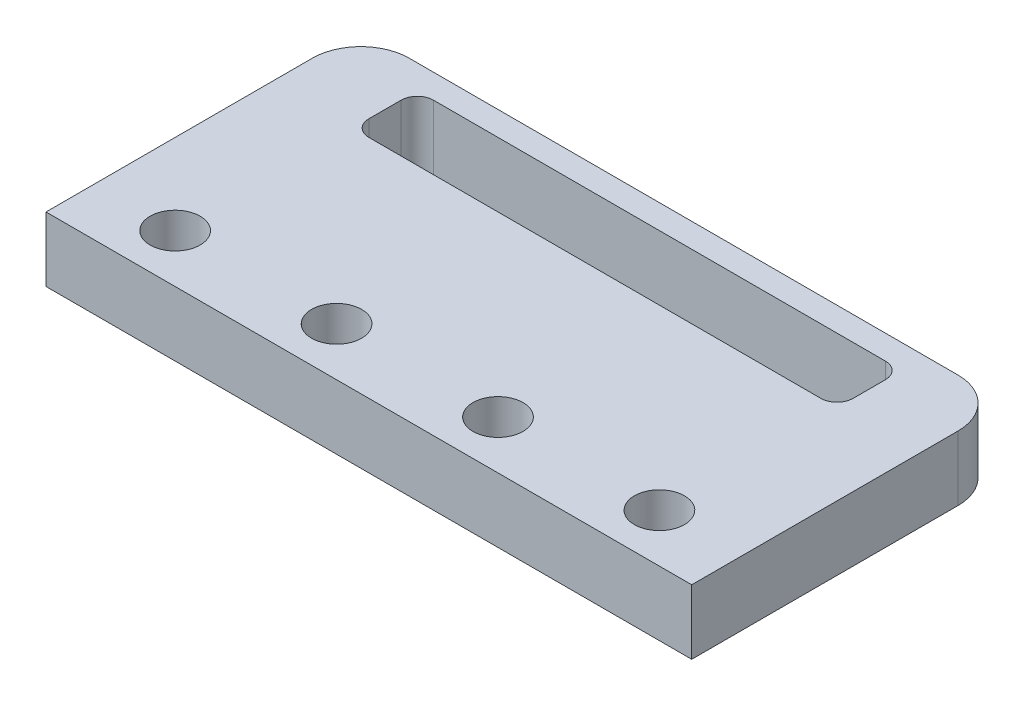
ISO-10303-21;
HEADER;
FILE_DESCRIPTION(('STEP AP214'),'2;1');
FILE_NAME('part.step','',(''),(''),'','','');
FILE_SCHEMA(('AUTOMOTIVE_DESIGN { 1 0 10303 214 1 1 1 1 }'));
ENDSEC;
DATA;
#1=APPLICATION_CONTEXT('core data for automotive mechanical design processes');
#2=APPLICATION_PROTOCOL_DEFINITION('international standard','automotive_design',2000,#1);
#3=PRODUCT_CONTEXT('',#1,'mechanical');
#4=PRODUCT('Part','Part','',(#3));
#5=PRODUCT_RELATED_PRODUCT_CATEGORY('part','',(#4));
#6=PRODUCT_DEFINITION_FORMATION('','',#4);
#7=PRODUCT_DEFINITION_CONTEXT('part definition',#1,'design');
#8=PRODUCT_DEFINITION('design','',#6,#7);
#9=PRODUCT_DEFINITION_SHAPE('','',#8);
#10=(LENGTH_UNIT() NAMED_UNIT(*) SI_UNIT(.MILLI.,.METRE.));
#11=(NAMED_UNIT(*) PLANE_ANGLE_UNIT() SI_UNIT($,.RADIAN.));
#12=(NAMED_UNIT(*) SI_UNIT($,.STERADIAN.) SOLID_ANGLE_UNIT());
#13=UNCERTAINTY_MEASURE_WITH_UNIT(LENGTH_MEASURE(1.E-05),#10,'distance_accuracy_value','');
#14=(GEOMETRIC_REPRESENTATION_CONTEXT(3) GLOBAL_UNCERTAINTY_ASSIGNED_CONTEXT((#13)) GLOBAL_UNIT_ASSIGNED_CONTEXT((#10,
#11,#12)) REPRESENTATION_CONTEXT('',''));
#15=CARTESIAN_POINT('',(0.,0.,0.));
#16=DIRECTION('',(0.,0.,1.));
#17=DIRECTION('',(1.,0.,0.));
#18=AXIS2_PLACEMENT_3D('',#15,#16,#17);
#19=CARTESIAN_POINT('',(0.,4.,0.));
#20=DIRECTION('',(0.,-1.,0.));
#21=DIRECTION('',(0.,0.,-1.));
#22=AXIS2_PLACEMENT_3D('',#19,#20,#21);
#23=PLANE('',#22);
#24=DIRECTION('',(0.,0.,-1.));
#25=VECTOR('',#24,1.);
#26=CARTESIAN_POINT('',(15.,4.,-5.25000000000001));
#27=LINE('',#26,#25);
#28=CARTESIAN_POINT('',(15.,4.,-5.25000000000001));
#29=VERTEX_POINT('',#28);
#30=CARTESIAN_POINT('',(15.,4.,-7.25));
#31=VERTEX_POINT('',#30);
#32=EDGE_CURVE('E191',#29,#31,#27,.T.);
#33=ORIENTED_EDGE('',*,*,#32,.F.);
#34=CARTESIAN_POINT('',(14.,4.,-5.25));
#35=DIRECTION('',(0.,1.,0.));
#36=DIRECTION('',(0.,0.,1.));
#37=AXIS2_PLACEMENT_3D('',#34,#35,#36);
#38=CIRCLE('',#37,1.);
#39=CARTESIAN_POINT('',(14.,4.,-4.25));
#40=VERTEX_POINT('',#39);
#41=EDGE_CURVE('E152',#40,#29,#38,.T.);
#42=ORIENTED_EDGE('',*,*,#41,.F.);
#43=DIRECTION('',(1.,0.,0.));
#44=VECTOR('',#43,1.);
#45=CARTESIAN_POINT('',(-14.,4.,-4.25));
#46=LINE('',#45,#44);
#47=CARTESIAN_POINT('',(-14.,4.,-4.25));
#48=VERTEX_POINT('',#47);
#49=EDGE_CURVE('E171',#48,#40,#46,.T.);
#50=ORIENTED_EDGE('',*,*,#49,.F.);
#51=CARTESIAN_POINT('',(-14.,4.,-5.25));
#52=DIRECTION('',(0.,1.,0.));
#53=DIRECTION('',(0.,0.,-1.));
#54=AXIS2_PLACEMENT_3D('',#51,#52,#53);
#55=CIRCLE('',#54,1.);
#56=CARTESIAN_POINT('',(-15.,4.,-5.25000000000001));
#57=VERTEX_POINT('',#56);
#58=EDGE_CURVE('E174',#57,#48,#55,.T.);
#59=ORIENTED_EDGE('',*,*,#58,.F.);
#60=DIRECTION('',(0.,0.,1.));
#61=VECTOR('',#60,1.);
#62=CARTESIAN_POINT('',(-15.,4.,-5.25000000000001));
#63=LINE('',#62,#61);
#64=CARTESIAN_POINT('',(-15.,4.,-7.25));
#65=VERTEX_POINT('',#64);
#66=EDGE_CURVE('E202',#65,#57,#63,.T.);
#67=ORIENTED_EDGE('',*,*,#66,.F.);
#68=CARTESIAN_POINT('',(-14.,4.,-7.25));
#69=DIRECTION('',(0.,1.,0.));
#70=DIRECTION('',(0.,0.,-1.));
#71=AXIS2_PLACEMENT_3D('',#68,#69,#70);
#72=CIRCLE('',#71,1.);
#73=CARTESIAN_POINT('',(-14.,4.,-8.25));
#74=VERTEX_POINT('',#73);
#75=EDGE_CURVE('E199',#74,#65,#72,.T.);
#76=ORIENTED_EDGE('',*,*,#75,.F.);
#77=DIRECTION('',(-1.,0.,0.));
#78=VECTOR('',#77,1.);
#79=CARTESIAN_POINT('',(-14.,4.,-8.25));
#80=LINE('',#79,#78);
#81=CARTESIAN_POINT('',(14.,4.,-8.25));
#82=VERTEX_POINT('',#81);
#83=EDGE_CURVE('E196',#82,#74,#80,.T.);
#84=ORIENTED_EDGE('',*,*,#83,.F.);
#85=CARTESIAN_POINT('',(14.,4.,-7.25));
#86=DIRECTION('',(0.,1.,0.));
#87=DIRECTION('',(0.,0.,-1.));
#88=AXIS2_PLACEMENT_3D('',#85,#86,#87);
#89=CIRCLE('',#88,1.);
#90=EDGE_CURVE('E193',#31,#82,#89,.T.);
#91=ORIENTED_EDGE('',*,*,#90,.F.);
#92=EDGE_LOOP('',(#33,#42,#50,#59,#67,#76,#84,#91));
#93=FACE_BOUND('',#92,.T.);
#94=DIRECTION('',(0.,0.,-1.));
#95=VECTOR('',#94,1.);
#96=CARTESIAN_POINT('',(20.,4.,9.75));
#97=LINE('',#96,#95);
#98=CARTESIAN_POINT('',(20.,4.,9.75));
#99=VERTEX_POINT('',#98);
#100=CARTESIAN_POINT('',(20.,4.,-6.75));
#101=VERTEX_POINT('',#100);
#102=EDGE_CURVE('E245',#99,#101,#97,.T.);
#103=ORIENTED_EDGE('',*,*,#102,.T.);
#104=CARTESIAN_POINT('',(17.,4.,-6.75));
#105=DIRECTION('',(0.,-1.,0.));
#106=DIRECTION('',(0.,0.,-1.));
#107=AXIS2_PLACEMENT_3D('',#104,#105,#106);
#108=CIRCLE('',#107,3.);
#109=CARTESIAN_POINT('',(17.,4.,-9.75));
#110=VERTEX_POINT('',#109);
#111=EDGE_CURVE('E49',#101,#110,#108,.F.);
#112=ORIENTED_EDGE('',*,*,#111,.T.);
#113=DIRECTION('',(-1.,0.,0.));
#114=VECTOR('',#113,1.);
#115=CARTESIAN_POINT('',(-20.,4.,-9.75));
#116=LINE('',#115,#114);
#117=CARTESIAN_POINT('',(-17.,4.,-9.75));
#118=VERTEX_POINT('',#117);
#119=EDGE_CURVE('E247',#110,#118,#116,.T.);
#120=ORIENTED_EDGE('',*,*,#119,.T.);
#121=CARTESIAN_POINT('',(-17.,4.,-6.75));
#122=DIRECTION('',(0.,-1.,0.));
#123=DIRECTION('',(0.,0.,-1.));
#124=AXIS2_PLACEMENT_3D('',#121,#122,#123);
#125=CIRCLE('',#124,3.);
#126=CARTESIAN_POINT('',(-20.,4.,-6.75));
#127=VERTEX_POINT('',#126);
#128=EDGE_CURVE('E56',#118,#127,#125,.F.);
#129=ORIENTED_EDGE('',*,*,#128,.T.);
#130=DIRECTION('',(0.,0.,1.));
#131=VECTOR('',#130,1.);
#132=CARTESIAN_POINT('',(-20.,4.,9.75));
#133=LINE('',#132,#131);
#134=CARTESIAN_POINT('',(-20.,4.,9.75));
#135=VERTEX_POINT('',#134);
#136=EDGE_CURVE('E250',#127,#135,#133,.T.);
#137=ORIENTED_EDGE('',*,*,#136,.T.);
#138=DIRECTION('',(1.,0.,0.));
#139=VECTOR('',#138,1.);
#140=CARTESIAN_POINT('',(-20.,4.,9.75));
#141=LINE('',#140,#139);
#142=EDGE_CURVE('E252',#135,#99,#141,.T.);
#143=ORIENTED_EDGE('',*,*,#142,.T.);
#144=EDGE_LOOP('',(#103,#112,#120,#129,#137,#143));
#145=FACE_BOUND('',#144,.T.);
#146=CARTESIAN_POINT('',(-15.,4.,6.75));
#147=DIRECTION('',(0.,1.,0.));
#148=DIRECTION('',(0.,0.,1.));
#149=AXIS2_PLACEMENT_3D('',#146,#147,#148);
#150=CIRCLE('',#149,1.55);
#151=CARTESIAN_POINT('',(-15.,4.,8.3));
#152=VERTEX_POINT('',#151);
#153=EDGE_CURVE('E239',#152,#152,#150,.T.);
#154=ORIENTED_EDGE('',*,*,#153,.F.);
#155=EDGE_LOOP('',(#154));
#156=FACE_BOUND('',#155,.T.);
#157=CARTESIAN_POINT('',(-5.,4.,6.75));
#158=DIRECTION('',(0.,1.,0.));
#159=DIRECTION('',(0.,0.,1.));
#160=AXIS2_PLACEMENT_3D('',#157,#158,#159);
#161=CIRCLE('',#160,1.55);
#162=CARTESIAN_POINT('',(-5.,4.,8.3));
#163=VERTEX_POINT('',#162);
#164=EDGE_CURVE('E233',#163,#163,#161,.T.);
#165=ORIENTED_EDGE('',*,*,#164,.F.);
#166=EDGE_LOOP('',(#165));
#167=FACE_BOUND('',#166,.T.);
#168=CARTESIAN_POINT('',(15.,4.,6.75));
#169=DIRECTION('',(0.,1.,0.));
#170=DIRECTION('',(0.,0.,-1.));
#171=AXIS2_PLACEMENT_3D('',#168,#169,#170);
#172=CIRCLE('',#171,1.55);
#173=CARTESIAN_POINT('',(15.,4.,5.2));
#174=VERTEX_POINT('',#173);
#175=EDGE_CURVE('E227',#174,#174,#172,.T.);
#176=ORIENTED_EDGE('',*,*,#175,.F.);
#177=EDGE_LOOP('',(#176));
#178=FACE_BOUND('',#177,.T.);
#179=CARTESIAN_POINT('',(5.,4.,6.75));
#180=DIRECTION('',(0.,1.,0.));
#181=DIRECTION('',(0.,0.,-1.));
#182=AXIS2_PLACEMENT_3D('',#179,#180,#181);
#183=CIRCLE('',#182,1.55);
#184=CARTESIAN_POINT('',(5.,4.,5.2));
#185=VERTEX_POINT('',#184);
#186=EDGE_CURVE('E221',#185,#185,#183,.T.);
#187=ORIENTED_EDGE('',*,*,#186,.F.);
#188=EDGE_LOOP('',(#187));
#189=FACE_BOUND('',#188,.T.);
#190=ADVANCED_FACE('F41',(#93,#145,#156,#167,#178,#189),#23,.F.);
#191=CARTESIAN_POINT('',(0.,0.,0.));
#192=DIRECTION('',(0.,-1.,0.));
#193=DIRECTION('',(0.,0.,-1.));
#194=AXIS2_PLACEMENT_3D('',#191,#192,#193);
#195=PLANE('',#194);
#196=CARTESIAN_POINT('',(14.,0.,-5.25));
#197=DIRECTION('',(0.,1.,0.));
#198=DIRECTION('',(0.,0.,1.));
#199=AXIS2_PLACEMENT_3D('',#196,#197,#198);
#200=CIRCLE('',#199,1.);
#201=CARTESIAN_POINT('',(14.,0.,-4.25));
#202=VERTEX_POINT('',#201);
#203=CARTESIAN_POINT('',(15.,0.,-5.25000000000001));
#204=VERTEX_POINT('',#203);
#205=EDGE_CURVE('E149',#202,#204,#200,.T.);
#206=ORIENTED_EDGE('',*,*,#205,.T.);
#207=DIRECTION('',(0.,0.,-1.));
#208=VECTOR('',#207,1.);
#209=CARTESIAN_POINT('',(15.,0.,-5.25000000000001));
#210=LINE('',#209,#208);
#211=CARTESIAN_POINT('',(15.,0.,-7.25));
#212=VERTEX_POINT('',#211);
#213=EDGE_CURVE('E161',#204,#212,#210,.T.);
#214=ORIENTED_EDGE('',*,*,#213,.T.);
#215=CARTESIAN_POINT('',(14.,0.,-7.25));
#216=DIRECTION('',(0.,1.,0.));
#217=DIRECTION('',(0.,0.,-1.));
#218=AXIS2_PLACEMENT_3D('',#215,#216,#217);
#219=CIRCLE('',#218,1.);
#220=CARTESIAN_POINT('',(14.,0.,-8.25));
#221=VERTEX_POINT('',#220);
#222=EDGE_CURVE('E165',#212,#221,#219,.T.);
#223=ORIENTED_EDGE('',*,*,#222,.T.);
#224=DIRECTION('',(-1.,0.,0.));
#225=VECTOR('',#224,1.);
#226=CARTESIAN_POINT('',(-14.,0.,-8.25));
#227=LINE('',#226,#225);
#228=CARTESIAN_POINT('',(-14.,0.,-8.25));
#229=VERTEX_POINT('',#228);
#230=EDGE_CURVE('E178',#221,#229,#227,.T.);
#231=ORIENTED_EDGE('',*,*,#230,.T.);
#232=CARTESIAN_POINT('',(-14.,0.,-7.25));
#233=DIRECTION('',(0.,1.,0.));
#234=DIRECTION('',(0.,0.,-1.));
#235=AXIS2_PLACEMENT_3D('',#232,#233,#234);
#236=CIRCLE('',#235,1.);
#237=CARTESIAN_POINT('',(-15.,0.,-7.25));
#238=VERTEX_POINT('',#237);
#239=EDGE_CURVE('E181',#229,#238,#236,.T.);
#240=ORIENTED_EDGE('',*,*,#239,.T.);
#241=DIRECTION('',(0.,0.,1.));
#242=VECTOR('',#241,1.);
#243=CARTESIAN_POINT('',(-15.,0.,-5.25000000000001));
#244=LINE('',#243,#242);
#245=CARTESIAN_POINT('',(-15.,0.,-5.25000000000001));
#246=VERTEX_POINT('',#245);
#247=EDGE_CURVE('E184',#238,#246,#244,.T.);
#248=ORIENTED_EDGE('',*,*,#247,.T.);
#249=CARTESIAN_POINT('',(-14.,0.,-5.25));
#250=DIRECTION('',(0.,1.,0.));
#251=DIRECTION('',(0.,0.,-1.));
#252=AXIS2_PLACEMENT_3D('',#249,#250,#251);
#253=CIRCLE('',#252,1.);
#254=CARTESIAN_POINT('',(-14.,0.,-4.25));
#255=VERTEX_POINT('',#254);
#256=EDGE_CURVE('E187',#246,#255,#253,.T.);
#257=ORIENTED_EDGE('',*,*,#256,.T.);
#258=DIRECTION('',(1.,0.,0.));
#259=VECTOR('',#258,1.);
#260=CARTESIAN_POINT('',(-14.,0.,-4.25));
#261=LINE('',#260,#259);
#262=EDGE_CURVE('E157',#255,#202,#261,.T.);
#263=ORIENTED_EDGE('',*,*,#262,.T.);
#264=EDGE_LOOP('',(#206,#214,#223,#231,#240,#248,#257,#263));
#265=FACE_BOUND('',#264,.T.);
#266=CARTESIAN_POINT('',(15.,0.,6.75));
#267=DIRECTION('',(0.,1.,0.));
#268=DIRECTION('',(0.,0.,-1.));
#269=AXIS2_PLACEMENT_3D('',#266,#267,#268);
#270=CIRCLE('',#269,1.55);
#271=CARTESIAN_POINT('',(15.,0.,5.2));
#272=VERTEX_POINT('',#271);
#273=EDGE_CURVE('E224',#272,#272,#270,.T.);
#274=ORIENTED_EDGE('',*,*,#273,.T.);
#275=EDGE_LOOP('',(#274));
#276=FACE_BOUND('',#275,.T.);
#277=CARTESIAN_POINT('',(-15.,0.,6.75));
#278=DIRECTION('',(0.,1.,0.));
#279=DIRECTION('',(0.,0.,1.));
#280=AXIS2_PLACEMENT_3D('',#277,#278,#279);
#281=CIRCLE('',#280,1.55);
#282=CARTESIAN_POINT('',(-15.,0.,8.3));
#283=VERTEX_POINT('',#282);
#284=EDGE_CURVE('E236',#283,#283,#281,.T.);
#285=ORIENTED_EDGE('',*,*,#284,.T.);
#286=EDGE_LOOP('',(#285));
#287=FACE_BOUND('',#286,.T.);
#288=DIRECTION('',(-1.,0.,0.));
#289=VECTOR('',#288,1.);
#290=CARTESIAN_POINT('',(-20.,0.,-9.75));
#291=LINE('',#290,#289);
#292=CARTESIAN_POINT('',(17.,0.,-9.75));
#293=VERTEX_POINT('',#292);
#294=CARTESIAN_POINT('',(-17.,0.,-9.75));
#295=VERTEX_POINT('',#294);
#296=EDGE_CURVE('E256',#293,#295,#291,.T.);
#297=ORIENTED_EDGE('',*,*,#296,.F.);
#298=CARTESIAN_POINT('',(17.,0.,-6.75));
#299=DIRECTION('',(0.,-1.,0.));
#300=DIRECTION('',(0.,0.,-1.));
#301=AXIS2_PLACEMENT_3D('',#298,#299,#300);
#302=CIRCLE('',#301,3.);
#303=CARTESIAN_POINT('',(20.,0.,-6.75));
#304=VERTEX_POINT('',#303);
#305=EDGE_CURVE('E274',#293,#304,#302,.T.);
#306=ORIENTED_EDGE('',*,*,#305,.T.);
#307=DIRECTION('',(0.,0.,-1.));
#308=VECTOR('',#307,1.);
#309=CARTESIAN_POINT('',(20.,0.,9.75));
#310=LINE('',#309,#308);
#311=CARTESIAN_POINT('',(20.,0.,9.75));
#312=VERTEX_POINT('',#311);
#313=EDGE_CURVE('E242',#312,#304,#310,.T.);
#314=ORIENTED_EDGE('',*,*,#313,.F.);
#315=DIRECTION('',(1.,0.,0.));
#316=VECTOR('',#315,1.);
#317=CARTESIAN_POINT('',(-20.,0.,9.75));
#318=LINE('',#317,#316);
#319=CARTESIAN_POINT('',(-20.,0.,9.75));
#320=VERTEX_POINT('',#319);
#321=EDGE_CURVE('E248',#320,#312,#318,.T.);
#322=ORIENTED_EDGE('',*,*,#321,.F.);
#323=DIRECTION('',(0.,0.,1.));
#324=VECTOR('',#323,1.);
#325=CARTESIAN_POINT('',(-20.,0.,9.75));
#326=LINE('',#325,#324);
#327=CARTESIAN_POINT('',(-20.,0.,-6.75));
#328=VERTEX_POINT('',#327);
#329=EDGE_CURVE('E259',#328,#320,#326,.T.);
#330=ORIENTED_EDGE('',*,*,#329,.F.);
#331=CARTESIAN_POINT('',(-17.,0.,-6.75));
#332=DIRECTION('',(0.,-1.,0.));
#333=DIRECTION('',(0.,0.,-1.));
#334=AXIS2_PLACEMENT_3D('',#331,#332,#333);
#335=CIRCLE('',#334,3.);
#336=EDGE_CURVE('E272',#328,#295,#335,.T.);
#337=ORIENTED_EDGE('',*,*,#336,.T.);
#338=EDGE_LOOP('',(#297,#306,#314,#322,#330,#337));
#339=FACE_BOUND('',#338,.T.);
#340=CARTESIAN_POINT('',(-5.,0.,6.75));
#341=DIRECTION('',(0.,1.,0.));
#342=DIRECTION('',(0.,0.,1.));
#343=AXIS2_PLACEMENT_3D('',#340,#341,#342);
#344=CIRCLE('',#343,1.55);
#345=CARTESIAN_POINT('',(-5.,0.,8.3));
#346=VERTEX_POINT('',#345);
#347=EDGE_CURVE('E230',#346,#346,#344,.T.);
#348=ORIENTED_EDGE('',*,*,#347,.T.);
#349=EDGE_LOOP('',(#348));
#350=FACE_BOUND('',#349,.T.);
#351=CARTESIAN_POINT('',(5.,0.,6.75));
#352=DIRECTION('',(0.,1.,0.));
#353=DIRECTION('',(0.,0.,-1.));
#354=AXIS2_PLACEMENT_3D('',#351,#352,#353);
#355=CIRCLE('',#354,1.55);
#356=CARTESIAN_POINT('',(5.,0.,5.2));
#357=VERTEX_POINT('',#356);
#358=EDGE_CURVE('E209',#357,#357,#355,.T.);
#359=ORIENTED_EDGE('',*,*,#358,.T.);
#360=EDGE_LOOP('',(#359));
#361=FACE_BOUND('',#360,.T.);
#362=ADVANCED_FACE('F167',(#265,#276,#287,#339,#350,#361),#195,.T.);
#363=CARTESIAN_POINT('',(20.,4.,9.75));
#364=DIRECTION('',(-1.,0.,0.));
#365=DIRECTION('',(0.,0.,1.));
#366=AXIS2_PLACEMENT_3D('',#363,#364,#365);
#367=PLANE('',#366);
#368=ORIENTED_EDGE('',*,*,#313,.T.);
#369=DIRECTION('',(0.,-1.,0.));
#370=VECTOR('',#369,1.);
#371=CARTESIAN_POINT('',(20.,4.,-6.75));
#372=LINE('',#371,#370);
#373=EDGE_CURVE('E64',#304,#101,#372,.F.);
#374=ORIENTED_EDGE('',*,*,#373,.T.);
#375=ORIENTED_EDGE('',*,*,#102,.F.);
#376=DIRECTION('',(0.,-1.,0.));
#377=VECTOR('',#376,1.);
#378=CARTESIAN_POINT('',(20.,4.,9.75));
#379=LINE('',#378,#377);
#380=EDGE_CURVE('E254',#99,#312,#379,.T.);
#381=ORIENTED_EDGE('',*,*,#380,.T.);
#382=EDGE_LOOP('',(#368,#374,#375,#381));
#383=FACE_BOUND('',#382,.T.);
#384=ADVANCED_FACE('F291',(#383),#367,.F.);
#385=CARTESIAN_POINT('',(-20.,4.,-9.75));
#386=DIRECTION('',(0.,0.,1.));
#387=DIRECTION('',(1.,0.,0.));
#388=AXIS2_PLACEMENT_3D('',#385,#386,#387);
#389=PLANE('',#388);
#390=ORIENTED_EDGE('',*,*,#119,.F.);
#391=DIRECTION('',(0.,-1.,0.));
#392=VECTOR('',#391,1.);
#393=CARTESIAN_POINT('',(17.,4.,-9.75));
#394=LINE('',#393,#392);
#395=EDGE_CURVE('E269',#110,#293,#394,.T.);
#396=ORIENTED_EDGE('',*,*,#395,.T.);
#397=ORIENTED_EDGE('',*,*,#296,.T.);
#398=DIRECTION('',(0.,-1.,0.));
#399=VECTOR('',#398,1.);
#400=CARTESIAN_POINT('',(-17.,4.,-9.75));
#401=LINE('',#400,#399);
#402=EDGE_CURVE('E267',#295,#118,#401,.F.);
#403=ORIENTED_EDGE('',*,*,#402,.T.);
#404=EDGE_LOOP('',(#390,#396,#397,#403));
#405=FACE_BOUND('',#404,.T.);
#406=ADVANCED_FACE('F283',(#405),#389,.F.);
#407=CARTESIAN_POINT('',(-20.,4.,9.75));
#408=DIRECTION('',(1.,0.,0.));
#409=DIRECTION('',(0.,0.,-1.));
#410=AXIS2_PLACEMENT_3D('',#407,#408,#409);
#411=PLANE('',#410);
#412=ORIENTED_EDGE('',*,*,#136,.F.);
#413=DIRECTION('',(0.,-1.,0.));
#414=VECTOR('',#413,1.);
#415=CARTESIAN_POINT('',(-20.,4.,-6.75));
#416=LINE('',#415,#414);
#417=EDGE_CURVE('E11',#127,#328,#416,.T.);
#418=ORIENTED_EDGE('',*,*,#417,.T.);
#419=ORIENTED_EDGE('',*,*,#329,.T.);
#420=DIRECTION('',(0.,-1.,0.));
#421=VECTOR('',#420,1.);
#422=CARTESIAN_POINT('',(-20.,4.,9.75));
#423=LINE('',#422,#421);
#424=EDGE_CURVE('E264',#135,#320,#423,.T.);
#425=ORIENTED_EDGE('',*,*,#424,.F.);
#426=EDGE_LOOP('',(#412,#418,#419,#425));
#427=FACE_BOUND('',#426,.T.);
#428=ADVANCED_FACE('F299',(#427),#411,.F.);
#429=CARTESIAN_POINT('',(-20.,4.,9.75));
#430=DIRECTION('',(0.,0.,-1.));
#431=DIRECTION('',(-1.,0.,0.));
#432=AXIS2_PLACEMENT_3D('',#429,#430,#431);
#433=PLANE('',#432);
#434=ORIENTED_EDGE('',*,*,#321,.T.);
#435=ORIENTED_EDGE('',*,*,#380,.F.);
#436=ORIENTED_EDGE('',*,*,#142,.F.);
#437=ORIENTED_EDGE('',*,*,#424,.T.);
#438=EDGE_LOOP('',(#434,#435,#436,#437));
#439=FACE_BOUND('',#438,.T.);
#440=ADVANCED_FACE('F295',(#439),#433,.F.);
#441=CARTESIAN_POINT('',(-15.,4.,6.75));
#442=DIRECTION('',(0.,-1.,0.));
#443=DIRECTION('',(0.,0.,-1.));
#444=AXIS2_PLACEMENT_3D('',#441,#442,#443);
#445=CYLINDRICAL_SURFACE('',#444,1.55);
#446=ORIENTED_EDGE('',*,*,#153,.T.);
#447=EDGE_LOOP('',(#446));
#448=FACE_BOUND('',#447,.T.);
#449=ORIENTED_EDGE('',*,*,#284,.F.);
#450=EDGE_LOOP('',(#449));
#451=FACE_BOUND('',#450,.T.);
#452=ADVANCED_FACE('F315',(#448,#451),#445,.F.);
#453=CARTESIAN_POINT('',(-5.,4.,6.75));
#454=DIRECTION('',(0.,-1.,0.));
#455=DIRECTION('',(0.,0.,-1.));
#456=AXIS2_PLACEMENT_3D('',#453,#454,#455);
#457=CYLINDRICAL_SURFACE('',#456,1.55);
#458=ORIENTED_EDGE('',*,*,#164,.T.);
#459=EDGE_LOOP('',(#458));
#460=FACE_BOUND('',#459,.T.);
#461=ORIENTED_EDGE('',*,*,#347,.F.);
#462=EDGE_LOOP('',(#461));
#463=FACE_BOUND('',#462,.T.);
#464=ADVANCED_FACE('F448',(#460,#463),#457,.F.);
#465=CARTESIAN_POINT('',(15.,4.,6.75));
#466=DIRECTION('',(0.,-1.,0.));
#467=DIRECTION('',(0.,0.,-1.));
#468=AXIS2_PLACEMENT_3D('',#465,#466,#467);
#469=CYLINDRICAL_SURFACE('',#468,1.55);
#470=ORIENTED_EDGE('',*,*,#175,.T.);
#471=EDGE_LOOP('',(#470));
#472=FACE_BOUND('',#471,.T.);
#473=ORIENTED_EDGE('',*,*,#273,.F.);
#474=EDGE_LOOP('',(#473));
#475=FACE_BOUND('',#474,.T.);
#476=ADVANCED_FACE('F438',(#472,#475),#469,.F.);
#477=CARTESIAN_POINT('',(5.,4.,6.75));
#478=DIRECTION('',(0.,-1.,0.));
#479=DIRECTION('',(0.,0.,-1.));
#480=AXIS2_PLACEMENT_3D('',#477,#478,#479);
#481=CYLINDRICAL_SURFACE('',#480,1.55);
#482=ORIENTED_EDGE('',*,*,#186,.T.);
#483=EDGE_LOOP('',(#482));
#484=FACE_BOUND('',#483,.T.);
#485=ORIENTED_EDGE('',*,*,#358,.F.);
#486=EDGE_LOOP('',(#485));
#487=FACE_BOUND('',#486,.T.);
#488=ADVANCED_FACE('F429',(#484,#487),#481,.F.);
#489=CARTESIAN_POINT('',(14.,0.,-5.25));
#490=DIRECTION('',(0.,1.,0.));
#491=DIRECTION('',(0.,0.,1.));
#492=AXIS2_PLACEMENT_3D('',#489,#490,#491);
#493=CYLINDRICAL_SURFACE('',#492,1.);
#494=ORIENTED_EDGE('',*,*,#41,.T.);
#495=DIRECTION('',(0.,1.,0.));
#496=VECTOR('',#495,1.);
#497=CARTESIAN_POINT('',(15.,0.,-5.25000000000001));
#498=LINE('',#497,#496);
#499=EDGE_CURVE('E145',#204,#29,#498,.T.);
#500=ORIENTED_EDGE('',*,*,#499,.F.);
#501=ORIENTED_EDGE('',*,*,#205,.F.);
#502=DIRECTION('',(0.,1.,0.));
#503=VECTOR('',#502,1.);
#504=CARTESIAN_POINT('',(14.,0.,-4.25));
#505=LINE('',#504,#503);
#506=EDGE_CURVE('E207',#202,#40,#505,.T.);
#507=ORIENTED_EDGE('',*,*,#506,.T.);
#508=EDGE_LOOP('',(#494,#500,#501,#507));
#509=FACE_BOUND('',#508,.T.);
#510=ADVANCED_FACE('F147',(#509),#493,.F.);
#511=CARTESIAN_POINT('',(-14.,0.,-4.25));
#512=DIRECTION('',(0.,0.,1.));
#513=DIRECTION('',(1.,0.,0.));
#514=AXIS2_PLACEMENT_3D('',#511,#512,#513);
#515=PLANE('',#514);
#516=ORIENTED_EDGE('',*,*,#49,.T.);
#517=ORIENTED_EDGE('',*,*,#506,.F.);
#518=ORIENTED_EDGE('',*,*,#262,.F.);
#519=DIRECTION('',(0.,1.,0.));
#520=VECTOR('',#519,1.);
#521=CARTESIAN_POINT('',(-14.,0.,-4.25));
#522=LINE('',#521,#520);
#523=EDGE_CURVE('E210',#255,#48,#522,.T.);
#524=ORIENTED_EDGE('',*,*,#523,.T.);
#525=EDGE_LOOP('',(#516,#517,#518,#524));
#526=FACE_BOUND('',#525,.T.);
#527=ADVANCED_FACE('F410',(#526),#515,.F.);
#528=CARTESIAN_POINT('',(-14.,0.,-5.25));
#529=DIRECTION('',(0.,1.,0.));
#530=DIRECTION('',(0.,0.,1.));
#531=AXIS2_PLACEMENT_3D('',#528,#529,#530);
#532=CYLINDRICAL_SURFACE('',#531,1.);
#533=ORIENTED_EDGE('',*,*,#58,.T.);
#534=ORIENTED_EDGE('',*,*,#523,.F.);
#535=ORIENTED_EDGE('',*,*,#256,.F.);
#536=DIRECTION('',(0.,1.,0.));
#537=VECTOR('',#536,1.);
#538=CARTESIAN_POINT('',(-15.,0.,-5.25000000000001));
#539=LINE('',#538,#537);
#540=EDGE_CURVE('E212',#246,#57,#539,.T.);
#541=ORIENTED_EDGE('',*,*,#540,.T.);
#542=EDGE_LOOP('',(#533,#534,#535,#541));
#543=FACE_BOUND('',#542,.T.);
#544=ADVANCED_FACE('F400',(#543),#532,.F.);
#545=CARTESIAN_POINT('',(-15.,0.,-5.25000000000001));
#546=DIRECTION('',(-1.,0.,0.));
#547=DIRECTION('',(0.,0.,1.));
#548=AXIS2_PLACEMENT_3D('',#545,#546,#547);
#549=PLANE('',#548);
#550=ORIENTED_EDGE('',*,*,#66,.T.);
#551=ORIENTED_EDGE('',*,*,#540,.F.);
#552=ORIENTED_EDGE('',*,*,#247,.F.);
#553=DIRECTION('',(0.,1.,0.));
#554=VECTOR('',#553,1.);
#555=CARTESIAN_POINT('',(-15.,0.,-7.25));
#556=LINE('',#555,#554);
#557=EDGE_CURVE('E214',#238,#65,#556,.T.);
#558=ORIENTED_EDGE('',*,*,#557,.T.);
#559=EDGE_LOOP('',(#550,#551,#552,#558));
#560=FACE_BOUND('',#559,.T.);
#561=ADVANCED_FACE('F390',(#560),#549,.F.);
#562=CARTESIAN_POINT('',(-14.,0.,-7.25));
#563=DIRECTION('',(0.,1.,0.));
#564=DIRECTION('',(0.,0.,1.));
#565=AXIS2_PLACEMENT_3D('',#562,#563,#564);
#566=CYLINDRICAL_SURFACE('',#565,1.);
#567=ORIENTED_EDGE('',*,*,#75,.T.);
#568=ORIENTED_EDGE('',*,*,#557,.F.);
#569=ORIENTED_EDGE('',*,*,#239,.F.);
#570=DIRECTION('',(0.,1.,0.));
#571=VECTOR('',#570,1.);
#572=CARTESIAN_POINT('',(-14.,0.,-8.25));
#573=LINE('',#572,#571);
#574=EDGE_CURVE('E216',#229,#74,#573,.T.);
#575=ORIENTED_EDGE('',*,*,#574,.T.);
#576=EDGE_LOOP('',(#567,#568,#569,#575));
#577=FACE_BOUND('',#576,.T.);
#578=ADVANCED_FACE('F380',(#577),#566,.F.);
#579=CARTESIAN_POINT('',(-14.,0.,-8.25));
#580=DIRECTION('',(0.,0.,-1.));
#581=DIRECTION('',(-1.,0.,0.));
#582=AXIS2_PLACEMENT_3D('',#579,#580,#581);
#583=PLANE('',#582);
#584=ORIENTED_EDGE('',*,*,#83,.T.);
#585=ORIENTED_EDGE('',*,*,#574,.F.);
#586=ORIENTED_EDGE('',*,*,#230,.F.);
#587=DIRECTION('',(0.,1.,0.));
#588=VECTOR('',#587,1.);
#589=CARTESIAN_POINT('',(14.,0.,-8.25));
#590=LINE('',#589,#588);
#591=EDGE_CURVE('E218',#221,#82,#590,.T.);
#592=ORIENTED_EDGE('',*,*,#591,.T.);
#593=EDGE_LOOP('',(#584,#585,#586,#592));
#594=FACE_BOUND('',#593,.T.);
#595=ADVANCED_FACE('F370',(#594),#583,.F.);
#596=CARTESIAN_POINT('',(14.,0.,-7.25));
#597=DIRECTION('',(0.,1.,0.));
#598=DIRECTION('',(0.,0.,1.));
#599=AXIS2_PLACEMENT_3D('',#596,#597,#598);
#600=CYLINDRICAL_SURFACE('',#599,1.);
#601=ORIENTED_EDGE('',*,*,#90,.T.);
#602=ORIENTED_EDGE('',*,*,#591,.F.);
#603=ORIENTED_EDGE('',*,*,#222,.F.);
#604=DIRECTION('',(0.,1.,0.));
#605=VECTOR('',#604,1.);
#606=CARTESIAN_POINT('',(15.,0.,-7.25));
#607=LINE('',#606,#605);
#608=EDGE_CURVE('E156',#212,#31,#607,.T.);
#609=ORIENTED_EDGE('',*,*,#608,.T.);
#610=EDGE_LOOP('',(#601,#602,#603,#609));
#611=FACE_BOUND('',#610,.T.);
#612=ADVANCED_FACE('F362',(#611),#600,.F.);
#613=CARTESIAN_POINT('',(15.,0.,-5.25000000000001));
#614=DIRECTION('',(1.,0.,0.));
#615=DIRECTION('',(0.,0.,-1.));
#616=AXIS2_PLACEMENT_3D('',#613,#614,#615);
#617=PLANE('',#616);
#618=ORIENTED_EDGE('',*,*,#32,.T.);
#619=ORIENTED_EDGE('',*,*,#608,.F.);
#620=ORIENTED_EDGE('',*,*,#213,.F.);
#621=ORIENTED_EDGE('',*,*,#499,.T.);
#622=EDGE_LOOP('',(#618,#619,#620,#621));
#623=FACE_BOUND('',#622,.T.);
#624=ADVANCED_FACE('F162',(#623),#617,.F.);
#625=CARTESIAN_POINT('',(17.,4.,-6.75));
#626=DIRECTION('',(0.,-1.,0.));
#627=DIRECTION('',(0.,0.,-1.));
#628=AXIS2_PLACEMENT_3D('',#625,#626,#627);
#629=CYLINDRICAL_SURFACE('',#628,3.);
#630=ORIENTED_EDGE('',*,*,#111,.F.);
#631=ORIENTED_EDGE('',*,*,#373,.F.);
#632=ORIENTED_EDGE('',*,*,#305,.F.);
#633=ORIENTED_EDGE('',*,*,#395,.F.);
#634=EDGE_LOOP('',(#630,#631,#632,#633));
#635=FACE_BOUND('',#634,.T.);
#636=ADVANCED_FACE('F286',(#635),#629,.T.);
#637=CARTESIAN_POINT('',(-17.,4.,-6.75));
#638=DIRECTION('',(0.,-1.,0.));
#639=DIRECTION('',(0.,0.,-1.));
#640=AXIS2_PLACEMENT_3D('',#637,#638,#639);
#641=CYLINDRICAL_SURFACE('',#640,3.);
#642=ORIENTED_EDGE('',*,*,#128,.F.);
#643=ORIENTED_EDGE('',*,*,#402,.F.);
#644=ORIENTED_EDGE('',*,*,#336,.F.);
#645=ORIENTED_EDGE('',*,*,#417,.F.);
#646=EDGE_LOOP('',(#642,#643,#644,#645));
#647=FACE_BOUND('',#646,.T.);
#648=ADVANCED_FACE('F43',(#647),#641,.T.);
#649=CLOSED_SHELL('',(#190,#362,#384,#406,#428,#440,#452,#464,#476,#488,#510,#527,#544,#561,
#578,#595,#612,#624,#636,#648));
#650=MANIFOLD_SOLID_BREP('B2',#649);
#651=ADVANCED_BREP_SHAPE_REPRESENTATION('',(#18,#650),#14);
#652=SHAPE_DEFINITION_REPRESENTATION(#9,#651);
ENDSEC;
END-ISO-10303-21;
